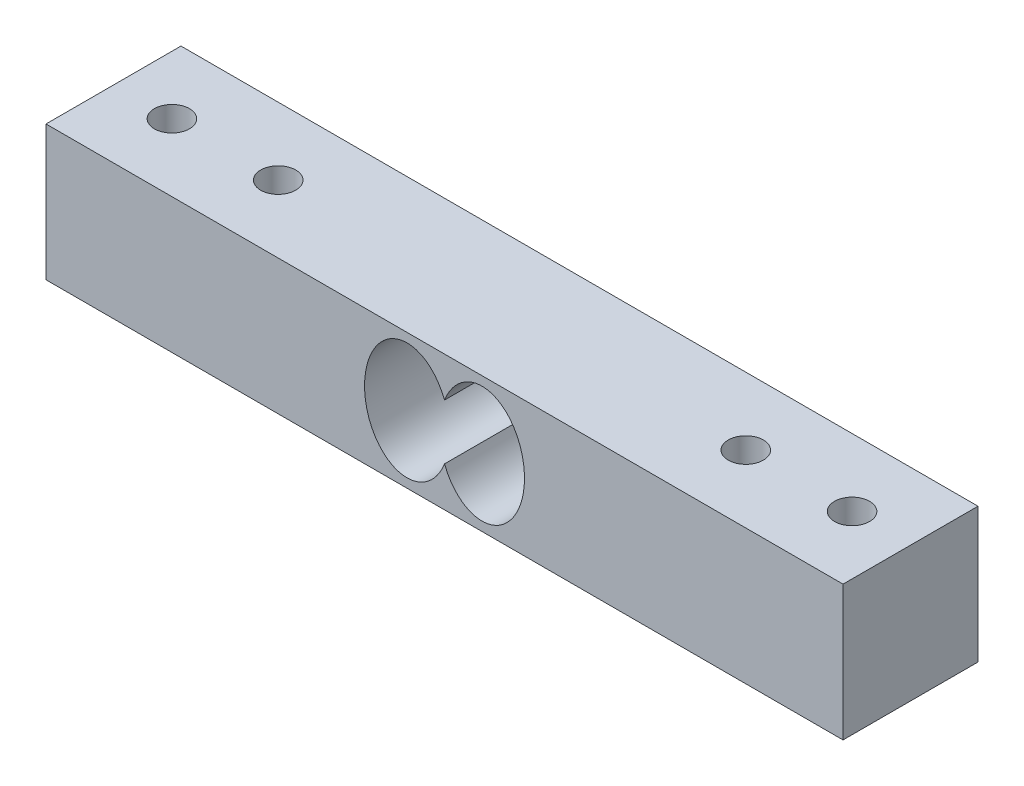
ISO-10303-21;
HEADER;
FILE_DESCRIPTION(('STEP AP214'),'2;1');
FILE_NAME('part.step','',(''),(''),'','','');
FILE_SCHEMA(('AUTOMOTIVE_DESIGN { 1 0 10303 214 1 1 1 1 }'));
ENDSEC;
DATA;
#1=APPLICATION_CONTEXT('core data for automotive mechanical design processes');
#2=APPLICATION_PROTOCOL_DEFINITION('international standard','automotive_design',2000,#1);
#3=PRODUCT_CONTEXT('',#1,'mechanical');
#4=PRODUCT('Part','Part','',(#3));
#5=PRODUCT_RELATED_PRODUCT_CATEGORY('part','',(#4));
#6=PRODUCT_DEFINITION_FORMATION('','',#4);
#7=PRODUCT_DEFINITION_CONTEXT('part definition',#1,'design');
#8=PRODUCT_DEFINITION('design','',#6,#7);
#9=PRODUCT_DEFINITION_SHAPE('','',#8);
#10=(LENGTH_UNIT() NAMED_UNIT(*) SI_UNIT(.MILLI.,.METRE.));
#11=(NAMED_UNIT(*) PLANE_ANGLE_UNIT() SI_UNIT($,.RADIAN.));
#12=(NAMED_UNIT(*) SI_UNIT($,.STERADIAN.) SOLID_ANGLE_UNIT());
#13=UNCERTAINTY_MEASURE_WITH_UNIT(LENGTH_MEASURE(1.E-05),#10,'distance_accuracy_value','');
#14=(GEOMETRIC_REPRESENTATION_CONTEXT(3) GLOBAL_UNCERTAINTY_ASSIGNED_CONTEXT((#13)) GLOBAL_UNIT_ASSIGNED_CONTEXT((#10,
#11,#12)) REPRESENTATION_CONTEXT('',''));
#15=CARTESIAN_POINT('',(0.,0.,0.));
#16=DIRECTION('',(0.,0.,1.));
#17=DIRECTION('',(1.,0.,0.));
#18=AXIS2_PLACEMENT_3D('',#15,#16,#17);
#19=CARTESIAN_POINT('',(0.,6.35,0.));
#20=DIRECTION('',(0.,-1.,0.));
#21=DIRECTION('',(0.,0.,-1.));
#22=AXIS2_PLACEMENT_3D('',#19,#20,#21);
#23=PLANE('',#22);
#24=DIRECTION('',(0.,0.,-1.));
#25=VECTOR('',#24,1.);
#26=CARTESIAN_POINT('',(37.5,6.35,6.35));
#27=LINE('',#26,#25);
#28=CARTESIAN_POINT('',(37.5,6.35,6.35));
#29=VERTEX_POINT('',#28);
#30=CARTESIAN_POINT('',(37.5,6.35,-6.35));
#31=VERTEX_POINT('',#30);
#32=EDGE_CURVE('E184',#29,#31,#27,.T.);
#33=ORIENTED_EDGE('',*,*,#32,.T.);
#34=DIRECTION('',(-1.,0.,0.));
#35=VECTOR('',#34,1.);
#36=CARTESIAN_POINT('',(-37.5,6.35,-6.35));
#37=LINE('',#36,#35);
#38=CARTESIAN_POINT('',(-37.5,6.35,-6.35));
#39=VERTEX_POINT('',#38);
#40=EDGE_CURVE('E201',#31,#39,#37,.T.);
#41=ORIENTED_EDGE('',*,*,#40,.T.);
#42=DIRECTION('',(0.,0.,1.));
#43=VECTOR('',#42,1.);
#44=CARTESIAN_POINT('',(-37.5,6.35,6.35));
#45=LINE('',#44,#43);
#46=CARTESIAN_POINT('',(-37.5,6.35,6.35));
#47=VERTEX_POINT('',#46);
#48=EDGE_CURVE('E175',#39,#47,#45,.T.);
#49=ORIENTED_EDGE('',*,*,#48,.T.);
#50=DIRECTION('',(1.,0.,0.));
#51=VECTOR('',#50,1.);
#52=CARTESIAN_POINT('',(-37.5,6.35,6.35));
#53=LINE('',#52,#51);
#54=EDGE_CURVE('E192',#47,#29,#53,.T.);
#55=ORIENTED_EDGE('',*,*,#54,.T.);
#56=EDGE_LOOP('',(#33,#41,#49,#55));
#57=FACE_BOUND('',#56,.T.);
#58=CARTESIAN_POINT('',(-32.,6.35,0.));
#59=DIRECTION('',(0.,1.,0.));
#60=DIRECTION('',(0.,0.,1.));
#61=AXIS2_PLACEMENT_3D('',#58,#59,#60);
#62=CIRCLE('',#61,1.65);
#63=CARTESIAN_POINT('',(-32.,6.35,1.65));
#64=VERTEX_POINT('',#63);
#65=EDGE_CURVE('E205',#64,#64,#62,.T.);
#66=ORIENTED_EDGE('',*,*,#65,.F.);
#67=EDGE_LOOP('',(#66));
#68=FACE_BOUND('',#67,.T.);
#69=CARTESIAN_POINT('',(-22.,6.35,0.));
#70=DIRECTION('',(0.,1.,0.));
#71=DIRECTION('',(0.,0.,1.));
#72=AXIS2_PLACEMENT_3D('',#69,#70,#71);
#73=CIRCLE('',#72,1.65);
#74=CARTESIAN_POINT('',(-22.,6.35,1.65));
#75=VERTEX_POINT('',#74);
#76=EDGE_CURVE('E213',#75,#75,#73,.T.);
#77=ORIENTED_EDGE('',*,*,#76,.F.);
#78=EDGE_LOOP('',(#77));
#79=FACE_BOUND('',#78,.T.);
#80=CARTESIAN_POINT('',(22.,6.35,0.));
#81=DIRECTION('',(0.,1.,0.));
#82=DIRECTION('',(0.,0.,1.));
#83=AXIS2_PLACEMENT_3D('',#80,#81,#82);
#84=CIRCLE('',#83,1.65);
#85=CARTESIAN_POINT('',(22.,6.35,1.65));
#86=VERTEX_POINT('',#85);
#87=EDGE_CURVE('E229',#86,#86,#84,.T.);
#88=ORIENTED_EDGE('',*,*,#87,.F.);
#89=EDGE_LOOP('',(#88));
#90=FACE_BOUND('',#89,.T.);
#91=CARTESIAN_POINT('',(32.,6.35,0.));
#92=DIRECTION('',(0.,1.,0.));
#93=DIRECTION('',(0.,0.,1.));
#94=AXIS2_PLACEMENT_3D('',#91,#92,#93);
#95=CIRCLE('',#94,1.65);
#96=CARTESIAN_POINT('',(32.,6.35,1.64999999999998));
#97=VERTEX_POINT('',#96);
#98=EDGE_CURVE('E232',#97,#97,#95,.T.);
#99=ORIENTED_EDGE('',*,*,#98,.F.);
#100=EDGE_LOOP('',(#99));
#101=FACE_BOUND('',#100,.T.);
#102=ADVANCED_FACE('F44',(#57,#68,#79,#90,#101),#23,.F.);
#103=CARTESIAN_POINT('',(0.,-6.35,0.));
#104=DIRECTION('',(0.,-1.,0.));
#105=DIRECTION('',(0.,0.,-1.));
#106=AXIS2_PLACEMENT_3D('',#103,#104,#105);
#107=PLANE('',#106);
#108=CARTESIAN_POINT('',(22.,-6.35,0.));
#109=DIRECTION('',(0.,1.,0.));
#110=DIRECTION('',(0.,0.,1.));
#111=AXIS2_PLACEMENT_3D('',#108,#109,#110);
#112=CIRCLE('',#111,1.65);
#113=CARTESIAN_POINT('',(22.,-6.35,1.65));
#114=VERTEX_POINT('',#113);
#115=EDGE_CURVE('E234',#114,#114,#112,.T.);
#116=ORIENTED_EDGE('',*,*,#115,.T.);
#117=EDGE_LOOP('',(#116));
#118=FACE_BOUND('',#117,.T.);
#119=CARTESIAN_POINT('',(-32.,-6.35,0.));
#120=DIRECTION('',(0.,1.,0.));
#121=DIRECTION('',(0.,0.,1.));
#122=AXIS2_PLACEMENT_3D('',#119,#120,#121);
#123=CIRCLE('',#122,1.65);
#124=CARTESIAN_POINT('',(-32.,-6.35,1.65));
#125=VERTEX_POINT('',#124);
#126=EDGE_CURVE('E208',#125,#125,#123,.T.);
#127=ORIENTED_EDGE('',*,*,#126,.T.);
#128=EDGE_LOOP('',(#127));
#129=FACE_BOUND('',#128,.T.);
#130=DIRECTION('',(0.,0.,-1.));
#131=VECTOR('',#130,1.);
#132=CARTESIAN_POINT('',(37.5,-6.35,6.35));
#133=LINE('',#132,#131);
#134=CARTESIAN_POINT('',(37.5,-6.35,6.35));
#135=VERTEX_POINT('',#134);
#136=CARTESIAN_POINT('',(37.5,-6.35,-6.35));
#137=VERTEX_POINT('',#136);
#138=EDGE_CURVE('E171',#135,#137,#133,.T.);
#139=ORIENTED_EDGE('',*,*,#138,.F.);
#140=DIRECTION('',(1.,0.,0.));
#141=VECTOR('',#140,1.);
#142=CARTESIAN_POINT('',(-37.5,-6.35,6.35));
#143=LINE('',#142,#141);
#144=CARTESIAN_POINT('',(-37.5,-6.35,6.35));
#145=VERTEX_POINT('',#144);
#146=EDGE_CURVE('E180',#145,#135,#143,.T.);
#147=ORIENTED_EDGE('',*,*,#146,.F.);
#148=DIRECTION('',(0.,0.,1.));
#149=VECTOR('',#148,1.);
#150=CARTESIAN_POINT('',(-37.5,-6.35,6.35));
#151=LINE('',#150,#149);
#152=CARTESIAN_POINT('',(-37.5,-6.35,-6.35));
#153=VERTEX_POINT('',#152);
#154=EDGE_CURVE('E170',#153,#145,#151,.T.);
#155=ORIENTED_EDGE('',*,*,#154,.F.);
#156=DIRECTION('',(-1.,0.,0.));
#157=VECTOR('',#156,1.);
#158=CARTESIAN_POINT('',(-37.5,-6.35,-6.35));
#159=LINE('',#158,#157);
#160=EDGE_CURVE('E161',#137,#153,#159,.T.);
#161=ORIENTED_EDGE('',*,*,#160,.F.);
#162=EDGE_LOOP('',(#139,#147,#155,#161));
#163=FACE_BOUND('',#162,.T.);
#164=CARTESIAN_POINT('',(-22.,-6.35,0.));
#165=DIRECTION('',(0.,1.,0.));
#166=DIRECTION('',(0.,0.,1.));
#167=AXIS2_PLACEMENT_3D('',#164,#165,#166);
#168=CIRCLE('',#167,1.65);
#169=CARTESIAN_POINT('',(-22.,-6.35,1.65));
#170=VERTEX_POINT('',#169);
#171=EDGE_CURVE('E216',#170,#170,#168,.T.);
#172=ORIENTED_EDGE('',*,*,#171,.T.);
#173=EDGE_LOOP('',(#172));
#174=FACE_BOUND('',#173,.T.);
#175=CARTESIAN_POINT('',(32.,-6.35,0.));
#176=DIRECTION('',(0.,1.,0.));
#177=DIRECTION('',(0.,0.,1.));
#178=AXIS2_PLACEMENT_3D('',#175,#176,#177);
#179=CIRCLE('',#178,1.65);
#180=CARTESIAN_POINT('',(32.,-6.35,1.64999999999998));
#181=VERTEX_POINT('',#180);
#182=EDGE_CURVE('E101',#181,#181,#179,.T.);
#183=ORIENTED_EDGE('',*,*,#182,.T.);
#184=EDGE_LOOP('',(#183));
#185=FACE_BOUND('',#184,.T.);
#186=ADVANCED_FACE('F142',(#118,#129,#163,#174,#185),#107,.T.);
#187=CARTESIAN_POINT('',(37.5,6.35,6.35));
#188=DIRECTION('',(-1.,0.,0.));
#189=DIRECTION('',(0.,0.,1.));
#190=AXIS2_PLACEMENT_3D('',#187,#188,#189);
#191=PLANE('',#190);
#192=ORIENTED_EDGE('',*,*,#138,.T.);
#193=DIRECTION('',(0.,-1.,0.));
#194=VECTOR('',#193,1.);
#195=CARTESIAN_POINT('',(37.5,6.35,-6.35));
#196=LINE('',#195,#194);
#197=EDGE_CURVE('E11',#31,#137,#196,.T.);
#198=ORIENTED_EDGE('',*,*,#197,.F.);
#199=ORIENTED_EDGE('',*,*,#32,.F.);
#200=DIRECTION('',(0.,-1.,0.));
#201=VECTOR('',#200,1.);
#202=CARTESIAN_POINT('',(37.5,6.35,6.35));
#203=LINE('',#202,#201);
#204=EDGE_CURVE('E188',#29,#135,#203,.T.);
#205=ORIENTED_EDGE('',*,*,#204,.T.);
#206=EDGE_LOOP('',(#192,#198,#199,#205));
#207=FACE_BOUND('',#206,.T.);
#208=ADVANCED_FACE('F46',(#207),#191,.F.);
#209=CARTESIAN_POINT('',(-37.5,6.35,-6.35));
#210=DIRECTION('',(0.,0.,1.));
#211=DIRECTION('',(1.,0.,0.));
#212=AXIS2_PLACEMENT_3D('',#209,#210,#211);
#213=PLANE('',#212);
#214=CARTESIAN_POINT('',(-3.52483514648803,0.,-6.35));
#215=DIRECTION('',(0.,0.,1.));
#216=DIRECTION('',(0.,1.,0.));
#217=AXIS2_PLACEMENT_3D('',#214,#215,#216);
#218=ELLIPSE('',#217,5.5,4.);
#219=CARTESIAN_POINT('',(0.,2.6,-6.35));
#220=VERTEX_POINT('',#219);
#221=CARTESIAN_POINT('',(0.,-2.6,-6.35));
#222=VERTEX_POINT('',#221);
#223=EDGE_CURVE('E118',#220,#222,#218,.T.);
#224=ORIENTED_EDGE('',*,*,#223,.T.);
#225=CARTESIAN_POINT('',(3.52483514648804,0.,-6.35));
#226=DIRECTION('',(0.,0.,1.));
#227=DIRECTION('',(0.,1.,0.));
#228=AXIS2_PLACEMENT_3D('',#225,#226,#227);
#229=ELLIPSE('',#228,5.5,4.);
#230=EDGE_CURVE('E60',#222,#220,#229,.T.);
#231=ORIENTED_EDGE('',*,*,#230,.T.);
#232=EDGE_LOOP('',(#224,#231));
#233=FACE_BOUND('',#232,.T.);
#234=ORIENTED_EDGE('',*,*,#160,.T.);
#235=DIRECTION('',(0.,-1.,0.));
#236=VECTOR('',#235,1.);
#237=CARTESIAN_POINT('',(-37.5,6.35,-6.35));
#238=LINE('',#237,#236);
#239=EDGE_CURVE('E53',#39,#153,#238,.T.);
#240=ORIENTED_EDGE('',*,*,#239,.F.);
#241=ORIENTED_EDGE('',*,*,#40,.F.);
#242=ORIENTED_EDGE('',*,*,#197,.T.);
#243=EDGE_LOOP('',(#234,#240,#241,#242));
#244=FACE_BOUND('',#243,.T.);
#245=ADVANCED_FACE('F151',(#233,#244),#213,.F.);
#246=CARTESIAN_POINT('',(-37.5,6.35,6.35));
#247=DIRECTION('',(1.,0.,0.));
#248=DIRECTION('',(0.,0.,-1.));
#249=AXIS2_PLACEMENT_3D('',#246,#247,#248);
#250=PLANE('',#249);
#251=ORIENTED_EDGE('',*,*,#154,.T.);
#252=DIRECTION('',(0.,-1.,0.));
#253=VECTOR('',#252,1.);
#254=CARTESIAN_POINT('',(-37.5,6.35,6.35));
#255=LINE('',#254,#253);
#256=EDGE_CURVE('E177',#47,#145,#255,.T.);
#257=ORIENTED_EDGE('',*,*,#256,.F.);
#258=ORIENTED_EDGE('',*,*,#48,.F.);
#259=ORIENTED_EDGE('',*,*,#239,.T.);
#260=EDGE_LOOP('',(#251,#257,#258,#259));
#261=FACE_BOUND('',#260,.T.);
#262=ADVANCED_FACE('F149',(#261),#250,.F.);
#263=CARTESIAN_POINT('',(-37.5,6.35,6.35));
#264=DIRECTION('',(0.,0.,-1.));
#265=DIRECTION('',(-1.,0.,0.));
#266=AXIS2_PLACEMENT_3D('',#263,#264,#265);
#267=PLANE('',#266);
#268=CARTESIAN_POINT('',(-3.52483514648803,0.,6.35));
#269=DIRECTION('',(0.,0.,1.));
#270=DIRECTION('',(0.,1.,0.));
#271=AXIS2_PLACEMENT_3D('',#268,#269,#270);
#272=ELLIPSE('',#271,5.5,4.);
#273=CARTESIAN_POINT('',(0.,2.6,6.35));
#274=VERTEX_POINT('',#273);
#275=CARTESIAN_POINT('',(0.,-2.6,6.35));
#276=VERTEX_POINT('',#275);
#277=EDGE_CURVE('E105',#274,#276,#272,.T.);
#278=ORIENTED_EDGE('',*,*,#277,.F.);
#279=CARTESIAN_POINT('',(3.52483514648804,0.,6.35));
#280=DIRECTION('',(0.,0.,1.));
#281=DIRECTION('',(0.,1.,0.));
#282=AXIS2_PLACEMENT_3D('',#279,#280,#281);
#283=ELLIPSE('',#282,5.5,4.);
#284=EDGE_CURVE('E65',#276,#274,#283,.T.);
#285=ORIENTED_EDGE('',*,*,#284,.F.);
#286=EDGE_LOOP('',(#278,#285));
#287=FACE_BOUND('',#286,.T.);
#288=ORIENTED_EDGE('',*,*,#146,.T.);
#289=ORIENTED_EDGE('',*,*,#204,.F.);
#290=ORIENTED_EDGE('',*,*,#54,.F.);
#291=ORIENTED_EDGE('',*,*,#256,.T.);
#292=EDGE_LOOP('',(#288,#289,#290,#291));
#293=FACE_BOUND('',#292,.T.);
#294=ADVANCED_FACE('F110',(#287,#293),#267,.F.);
#295=CARTESIAN_POINT('',(-32.,6.35,0.));
#296=DIRECTION('',(0.,-1.,0.));
#297=DIRECTION('',(0.,0.,-1.));
#298=AXIS2_PLACEMENT_3D('',#295,#296,#297);
#299=CYLINDRICAL_SURFACE('',#298,1.65);
#300=ORIENTED_EDGE('',*,*,#65,.T.);
#301=EDGE_LOOP('',(#300));
#302=FACE_BOUND('',#301,.T.);
#303=ORIENTED_EDGE('',*,*,#126,.F.);
#304=EDGE_LOOP('',(#303));
#305=FACE_BOUND('',#304,.T.);
#306=ADVANCED_FACE('F135',(#302,#305),#299,.F.);
#307=CARTESIAN_POINT('',(-22.,6.35,0.));
#308=DIRECTION('',(0.,-1.,0.));
#309=DIRECTION('',(0.,0.,-1.));
#310=AXIS2_PLACEMENT_3D('',#307,#308,#309);
#311=CYLINDRICAL_SURFACE('',#310,1.65);
#312=ORIENTED_EDGE('',*,*,#76,.T.);
#313=EDGE_LOOP('',(#312));
#314=FACE_BOUND('',#313,.T.);
#315=ORIENTED_EDGE('',*,*,#171,.F.);
#316=EDGE_LOOP('',(#315));
#317=FACE_BOUND('',#316,.T.);
#318=ADVANCED_FACE('F131',(#314,#317),#311,.F.);
#319=CARTESIAN_POINT('',(22.,6.35,0.));
#320=DIRECTION('',(0.,-1.,0.));
#321=DIRECTION('',(0.,0.,-1.));
#322=AXIS2_PLACEMENT_3D('',#319,#320,#321);
#323=CYLINDRICAL_SURFACE('',#322,1.65);
#324=ORIENTED_EDGE('',*,*,#87,.T.);
#325=EDGE_LOOP('',(#324));
#326=FACE_BOUND('',#325,.T.);
#327=ORIENTED_EDGE('',*,*,#115,.F.);
#328=EDGE_LOOP('',(#327));
#329=FACE_BOUND('',#328,.T.);
#330=ADVANCED_FACE('F127',(#326,#329),#323,.F.);
#331=CARTESIAN_POINT('',(32.,6.35,0.));
#332=DIRECTION('',(0.,-1.,0.));
#333=DIRECTION('',(0.,0.,-1.));
#334=AXIS2_PLACEMENT_3D('',#331,#332,#333);
#335=CYLINDRICAL_SURFACE('',#334,1.65);
#336=ORIENTED_EDGE('',*,*,#98,.T.);
#337=EDGE_LOOP('',(#336));
#338=FACE_BOUND('',#337,.T.);
#339=ORIENTED_EDGE('',*,*,#182,.F.);
#340=EDGE_LOOP('',(#339));
#341=FACE_BOUND('',#340,.T.);
#342=ADVANCED_FACE('F124',(#338,#341),#335,.F.);
#343=DIRECTION('',(0.,0.,1.));
#344=VECTOR('',#343,1.);
#345=SURFACE_OF_LINEAR_EXTRUSION('',#229,#344);
#346=DIRECTION('',(0.,0.,1.));
#347=VECTOR('',#346,1.);
#348=CARTESIAN_POINT('',(0.,2.6,-6.35));
#349=LINE('',#348,#347);
#350=EDGE_CURVE('E102',#220,#274,#349,.T.);
#351=ORIENTED_EDGE('',*,*,#350,.F.);
#352=ORIENTED_EDGE('',*,*,#230,.F.);
#353=DIRECTION('',(0.,0.,1.));
#354=VECTOR('',#353,1.);
#355=CARTESIAN_POINT('',(0.,-2.6,-6.35));
#356=LINE('',#355,#354);
#357=EDGE_CURVE('E94',#222,#276,#356,.T.);
#358=ORIENTED_EDGE('',*,*,#357,.T.);
#359=ORIENTED_EDGE('',*,*,#284,.T.);
#360=EDGE_LOOP('',(#351,#352,#358,#359));
#361=FACE_BOUND('',#360,.T.);
#362=ADVANCED_FACE('F96',(#361),#345,.F.);
#363=DIRECTION('',(0.,0.,1.));
#364=VECTOR('',#363,1.);
#365=SURFACE_OF_LINEAR_EXTRUSION('',#218,#364);
#366=ORIENTED_EDGE('',*,*,#357,.F.);
#367=ORIENTED_EDGE('',*,*,#223,.F.);
#368=ORIENTED_EDGE('',*,*,#350,.T.);
#369=ORIENTED_EDGE('',*,*,#277,.T.);
#370=EDGE_LOOP('',(#366,#367,#368,#369));
#371=FACE_BOUND('',#370,.T.);
#372=ADVANCED_FACE('F106',(#371),#365,.F.);
#373=CLOSED_SHELL('',(#102,#186,#208,#245,#262,#294,#306,#318,#330,#342,#362,#372));
#374=MANIFOLD_SOLID_BREP('B2',#373);
#375=ADVANCED_BREP_SHAPE_REPRESENTATION('',(#18,#374),#14);
#376=SHAPE_DEFINITION_REPRESENTATION(#9,#375);
ENDSEC;
END-ISO-10303-21;
